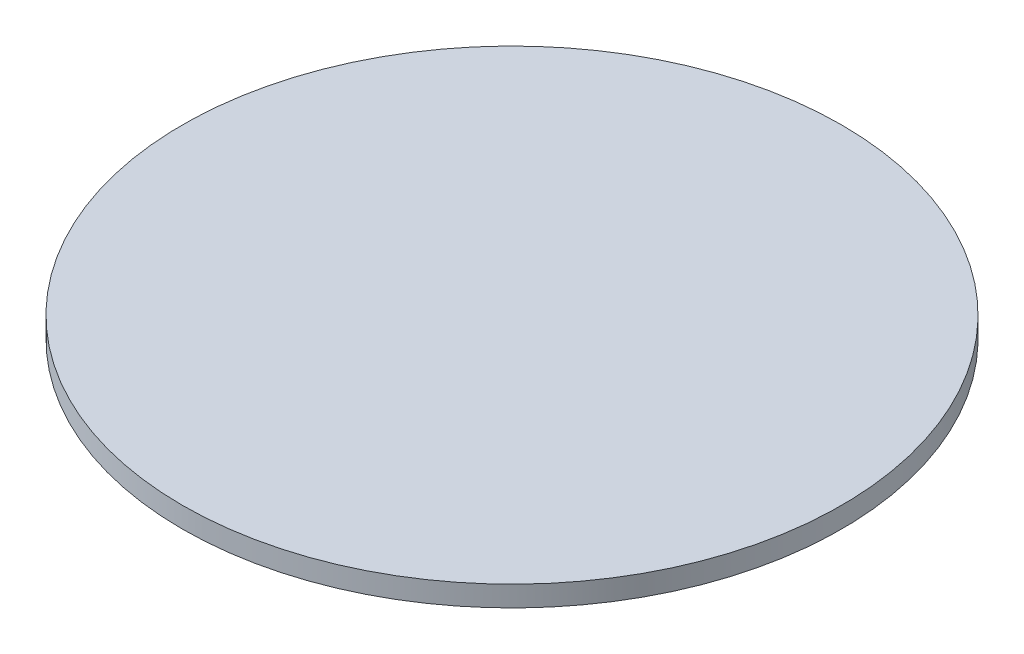
ISO-10303-21;
HEADER;
FILE_DESCRIPTION(('STEP AP214'),'2;1');
FILE_NAME('part.step','',(''),(''),'','','');
FILE_SCHEMA(('AUTOMOTIVE_DESIGN { 1 0 10303 214 1 1 1 1 }'));
ENDSEC;
DATA;
#1=APPLICATION_CONTEXT('core data for automotive mechanical design processes');
#2=APPLICATION_PROTOCOL_DEFINITION('international standard','automotive_design',2000,#1);
#3=PRODUCT_CONTEXT('',#1,'mechanical');
#4=PRODUCT('Part','Part','',(#3));
#5=PRODUCT_RELATED_PRODUCT_CATEGORY('part','',(#4));
#6=PRODUCT_DEFINITION_FORMATION('','',#4);
#7=PRODUCT_DEFINITION_CONTEXT('part definition',#1,'design');
#8=PRODUCT_DEFINITION('design','',#6,#7);
#9=PRODUCT_DEFINITION_SHAPE('','',#8);
#10=(LENGTH_UNIT() NAMED_UNIT(*) SI_UNIT(.MILLI.,.METRE.));
#11=(NAMED_UNIT(*) PLANE_ANGLE_UNIT() SI_UNIT($,.RADIAN.));
#12=(NAMED_UNIT(*) SI_UNIT($,.STERADIAN.) SOLID_ANGLE_UNIT());
#13=UNCERTAINTY_MEASURE_WITH_UNIT(LENGTH_MEASURE(1.E-05),#10,'distance_accuracy_value','');
#14=(GEOMETRIC_REPRESENTATION_CONTEXT(3) GLOBAL_UNCERTAINTY_ASSIGNED_CONTEXT((#13)) GLOBAL_UNIT_ASSIGNED_CONTEXT((#10,
#11,#12)) REPRESENTATION_CONTEXT('',''));
#15=CARTESIAN_POINT('',(0.,0.,0.));
#16=DIRECTION('',(0.,0.,1.));
#17=DIRECTION('',(1.,0.,0.));
#18=AXIS2_PLACEMENT_3D('',#15,#16,#17);
#19=CARTESIAN_POINT('',(0.,1.5875,0.));
#20=DIRECTION('',(0.,-1.,0.));
#21=DIRECTION('',(0.,0.,-1.));
#22=AXIS2_PLACEMENT_3D('',#19,#20,#21);
#23=CYLINDRICAL_SURFACE('',#22,25.4);
#24=CARTESIAN_POINT('',(0.,1.5875,0.));
#25=DIRECTION('',(0.,1.,0.));
#26=DIRECTION('',(0.,0.,1.));
#27=AXIS2_PLACEMENT_3D('',#24,#25,#26);
#28=CIRCLE('',#27,25.4);
#29=CARTESIAN_POINT('',(0.,1.5875,25.4));
#30=VERTEX_POINT('',#29);
#31=EDGE_CURVE('E10',#30,#30,#28,.T.);
#32=ORIENTED_EDGE('',*,*,#31,.F.);
#33=EDGE_LOOP('',(#32));
#34=FACE_BOUND('',#33,.T.);
#35=CARTESIAN_POINT('',(0.,0.,0.));
#36=DIRECTION('',(0.,1.,0.));
#37=DIRECTION('',(0.,0.,1.));
#38=AXIS2_PLACEMENT_3D('',#35,#36,#37);
#39=CIRCLE('',#38,25.4);
#40=CARTESIAN_POINT('',(0.,0.,25.4));
#41=VERTEX_POINT('',#40);
#42=EDGE_CURVE('E33',#41,#41,#39,.T.);
#43=ORIENTED_EDGE('',*,*,#42,.T.);
#44=EDGE_LOOP('',(#43));
#45=FACE_BOUND('',#44,.T.);
#46=ADVANCED_FACE('F30',(#34,#45),#23,.T.);
#47=CARTESIAN_POINT('',(0.,1.5875,0.));
#48=DIRECTION('',(0.,1.,0.));
#49=DIRECTION('',(0.,0.,1.));
#50=AXIS2_PLACEMENT_3D('',#47,#48,#49);
#51=PLANE('',#50);
#52=ORIENTED_EDGE('',*,*,#31,.T.);
#53=EDGE_LOOP('',(#52));
#54=FACE_BOUND('',#53,.T.);
#55=ADVANCED_FACE('F45',(#54),#51,.T.);
#56=CARTESIAN_POINT('',(0.,0.,0.));
#57=DIRECTION('',(0.,1.,0.));
#58=DIRECTION('',(0.,0.,1.));
#59=AXIS2_PLACEMENT_3D('',#56,#57,#58);
#60=PLANE('',#59);
#61=ORIENTED_EDGE('',*,*,#42,.F.);
#62=EDGE_LOOP('',(#61));
#63=FACE_BOUND('',#62,.T.);
#64=ADVANCED_FACE('F43',(#63),#60,.F.);
#65=CLOSED_SHELL('',(#46,#55,#64));
#66=MANIFOLD_SOLID_BREP('B2',#65);
#67=ADVANCED_BREP_SHAPE_REPRESENTATION('',(#18,#66),#14);
#68=SHAPE_DEFINITION_REPRESENTATION(#9,#67);
ENDSEC;
END-ISO-10303-21;
